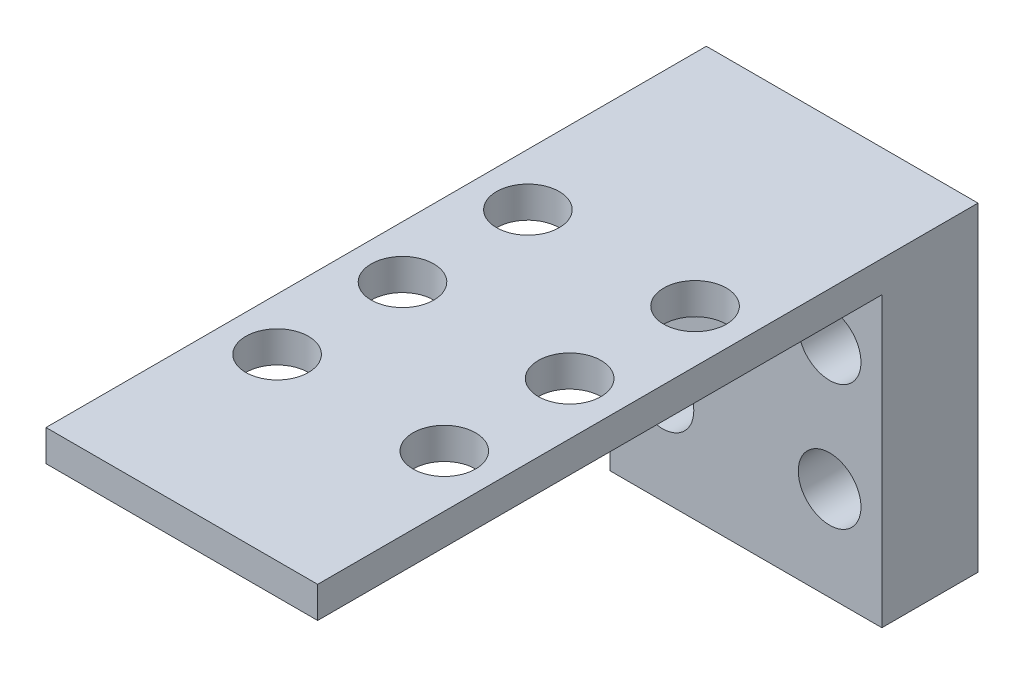
ISO-10303-21;
HEADER;
FILE_DESCRIPTION(('STEP AP214'),'2;1');
FILE_NAME('part.step','',(''),(''),'','','');
FILE_SCHEMA(('AUTOMOTIVE_DESIGN { 1 0 10303 214 1 1 1 1 }'));
ENDSEC;
DATA;
#1=APPLICATION_CONTEXT('core data for automotive mechanical design processes');
#2=APPLICATION_PROTOCOL_DEFINITION('international standard','automotive_design',2000,#1);
#3=PRODUCT_CONTEXT('',#1,'mechanical');
#4=PRODUCT('Part','Part','',(#3));
#5=PRODUCT_RELATED_PRODUCT_CATEGORY('part','',(#4));
#6=PRODUCT_DEFINITION_FORMATION('','',#4);
#7=PRODUCT_DEFINITION_CONTEXT('part definition',#1,'design');
#8=PRODUCT_DEFINITION('design','',#6,#7);
#9=PRODUCT_DEFINITION_SHAPE('','',#8);
#10=(LENGTH_UNIT() NAMED_UNIT(*) SI_UNIT(.MILLI.,.METRE.));
#11=(NAMED_UNIT(*) PLANE_ANGLE_UNIT() SI_UNIT($,.RADIAN.));
#12=(NAMED_UNIT(*) SI_UNIT($,.STERADIAN.) SOLID_ANGLE_UNIT());
#13=UNCERTAINTY_MEASURE_WITH_UNIT(LENGTH_MEASURE(1.E-05),#10,'distance_accuracy_value','');
#14=(GEOMETRIC_REPRESENTATION_CONTEXT(3) GLOBAL_UNCERTAINTY_ASSIGNED_CONTEXT((#13)) GLOBAL_UNIT_ASSIGNED_CONTEXT((#10,
#11,#12)) REPRESENTATION_CONTEXT('',''));
#15=CARTESIAN_POINT('',(0.,0.,0.));
#16=DIRECTION('',(0.,0.,1.));
#17=DIRECTION('',(1.,0.,0.));
#18=AXIS2_PLACEMENT_3D('',#15,#16,#17);
#19=CARTESIAN_POINT('',(-3.,43.5703212532729,17.04));
#20=DIRECTION('',(0.,-1.,0.));
#21=DIRECTION('',(0.,0.,-1.));
#22=AXIS2_PLACEMENT_3D('',#19,#20,#21);
#23=CYLINDRICAL_SURFACE('',#22,1.5);
#24=CARTESIAN_POINT('',(-3.,10.6036731257294,17.04));
#25=DIRECTION('',(0.,-1.,0.));
#26=DIRECTION('',(0.,0.,-1.));
#27=AXIS2_PLACEMENT_3D('',#24,#25,#26);
#28=CIRCLE('',#27,1.5);
#29=CARTESIAN_POINT('',(-3.,10.6036731257294,15.54));
#30=VERTEX_POINT('',#29);
#31=EDGE_CURVE('E12',#30,#30,#28,.T.);
#32=ORIENTED_EDGE('',*,*,#31,.F.);
#33=EDGE_LOOP('',(#32));
#34=FACE_BOUND('',#33,.T.);
#35=CARTESIAN_POINT('',(-3.,9.10367312572944,17.04));
#36=DIRECTION('',(0.,-1.,0.));
#37=DIRECTION('',(0.,0.,-1.));
#38=AXIS2_PLACEMENT_3D('',#35,#36,#37);
#39=CIRCLE('',#38,1.5);
#40=CARTESIAN_POINT('',(-3.,9.10367312572944,15.54));
#41=VERTEX_POINT('',#40);
#42=EDGE_CURVE('E171',#41,#41,#39,.T.);
#43=ORIENTED_EDGE('',*,*,#42,.T.);
#44=EDGE_LOOP('',(#43));
#45=FACE_BOUND('',#44,.T.);
#46=ADVANCED_FACE('F43',(#34,#45),#23,.F.);
#47=CARTESIAN_POINT('',(-3.,43.5703212532729,23.04));
#48=DIRECTION('',(0.,-1.,0.));
#49=DIRECTION('',(0.,0.,-1.));
#50=AXIS2_PLACEMENT_3D('',#47,#48,#49);
#51=CYLINDRICAL_SURFACE('',#50,1.5);
#52=CARTESIAN_POINT('',(-3.,10.6036731257294,23.04));
#53=DIRECTION('',(0.,-1.,0.));
#54=DIRECTION('',(0.,0.,-1.));
#55=AXIS2_PLACEMENT_3D('',#52,#53,#54);
#56=CIRCLE('',#55,1.5);
#57=CARTESIAN_POINT('',(-3.,10.6036731257294,21.54));
#58=VERTEX_POINT('',#57);
#59=EDGE_CURVE('E52',#58,#58,#56,.T.);
#60=ORIENTED_EDGE('',*,*,#59,.F.);
#61=EDGE_LOOP('',(#60));
#62=FACE_BOUND('',#61,.T.);
#63=CARTESIAN_POINT('',(-3.,9.10367312572944,23.04));
#64=DIRECTION('',(0.,-1.,0.));
#65=DIRECTION('',(0.,0.,-1.));
#66=AXIS2_PLACEMENT_3D('',#63,#64,#65);
#67=CIRCLE('',#66,1.5);
#68=CARTESIAN_POINT('',(-3.,9.10367312572944,21.54));
#69=VERTEX_POINT('',#68);
#70=EDGE_CURVE('E168',#69,#69,#67,.T.);
#71=ORIENTED_EDGE('',*,*,#70,.T.);
#72=EDGE_LOOP('',(#71));
#73=FACE_BOUND('',#72,.T.);
#74=ADVANCED_FACE('F265',(#62,#73),#51,.F.);
#75=CARTESIAN_POINT('',(5.,43.5703212532729,23.04));
#76=DIRECTION('',(0.,-1.,0.));
#77=DIRECTION('',(0.,0.,-1.));
#78=AXIS2_PLACEMENT_3D('',#75,#76,#77);
#79=CYLINDRICAL_SURFACE('',#78,1.5);
#80=CARTESIAN_POINT('',(5.,10.6036731257294,23.04));
#81=DIRECTION('',(0.,-1.,0.));
#82=DIRECTION('',(0.,0.,-1.));
#83=AXIS2_PLACEMENT_3D('',#80,#81,#82);
#84=CIRCLE('',#83,1.5);
#85=CARTESIAN_POINT('',(5.,10.6036731257294,21.54));
#86=VERTEX_POINT('',#85);
#87=EDGE_CURVE('E132',#86,#86,#84,.T.);
#88=ORIENTED_EDGE('',*,*,#87,.F.);
#89=EDGE_LOOP('',(#88));
#90=FACE_BOUND('',#89,.T.);
#91=CARTESIAN_POINT('',(5.,9.10367312572944,23.04));
#92=DIRECTION('',(0.,-1.,0.));
#93=DIRECTION('',(0.,0.,-1.));
#94=AXIS2_PLACEMENT_3D('',#91,#92,#93);
#95=CIRCLE('',#94,1.5);
#96=CARTESIAN_POINT('',(5.,9.10367312572944,21.54));
#97=VERTEX_POINT('',#96);
#98=EDGE_CURVE('E165',#97,#97,#95,.T.);
#99=ORIENTED_EDGE('',*,*,#98,.T.);
#100=EDGE_LOOP('',(#99));
#101=FACE_BOUND('',#100,.T.);
#102=ADVANCED_FACE('F271',(#90,#101),#79,.F.);
#103=CARTESIAN_POINT('',(5.,43.5703212532729,17.04));
#104=DIRECTION('',(0.,-1.,0.));
#105=DIRECTION('',(0.,0.,-1.));
#106=AXIS2_PLACEMENT_3D('',#103,#104,#105);
#107=CYLINDRICAL_SURFACE('',#106,1.5);
#108=CARTESIAN_POINT('',(5.,10.6036731257294,17.04));
#109=DIRECTION('',(0.,-1.,0.));
#110=DIRECTION('',(0.,0.,-1.));
#111=AXIS2_PLACEMENT_3D('',#108,#109,#110);
#112=CIRCLE('',#111,1.5);
#113=CARTESIAN_POINT('',(5.,10.6036731257294,15.54));
#114=VERTEX_POINT('',#113);
#115=EDGE_CURVE('E135',#114,#114,#112,.T.);
#116=ORIENTED_EDGE('',*,*,#115,.F.);
#117=EDGE_LOOP('',(#116));
#118=FACE_BOUND('',#117,.T.);
#119=CARTESIAN_POINT('',(5.,9.10367312572944,17.04));
#120=DIRECTION('',(0.,-1.,0.));
#121=DIRECTION('',(0.,0.,-1.));
#122=AXIS2_PLACEMENT_3D('',#119,#120,#121);
#123=CIRCLE('',#122,1.5);
#124=CARTESIAN_POINT('',(5.,9.10367312572944,15.54));
#125=VERTEX_POINT('',#124);
#126=EDGE_CURVE('E158',#125,#125,#123,.T.);
#127=ORIENTED_EDGE('',*,*,#126,.T.);
#128=EDGE_LOOP('',(#127));
#129=FACE_BOUND('',#128,.T.);
#130=ADVANCED_FACE('F317',(#118,#129),#107,.F.);
#131=CARTESIAN_POINT('',(-3.,43.5703212532729,11.04));
#132=DIRECTION('',(0.,-1.,0.));
#133=DIRECTION('',(0.,0.,-1.));
#134=AXIS2_PLACEMENT_3D('',#131,#132,#133);
#135=CYLINDRICAL_SURFACE('',#134,1.5);
#136=CARTESIAN_POINT('',(-3.,10.6036731257294,11.04));
#137=DIRECTION('',(0.,-1.,0.));
#138=DIRECTION('',(0.,0.,-1.));
#139=AXIS2_PLACEMENT_3D('',#136,#137,#138);
#140=CIRCLE('',#139,1.5);
#141=CARTESIAN_POINT('',(-3.,10.6036731257294,9.54));
#142=VERTEX_POINT('',#141);
#143=EDGE_CURVE('E137',#142,#142,#140,.T.);
#144=ORIENTED_EDGE('',*,*,#143,.F.);
#145=EDGE_LOOP('',(#144));
#146=FACE_BOUND('',#145,.T.);
#147=CARTESIAN_POINT('',(-3.,9.10367312572944,11.04));
#148=DIRECTION('',(0.,-1.,0.));
#149=DIRECTION('',(0.,0.,-1.));
#150=AXIS2_PLACEMENT_3D('',#147,#148,#149);
#151=CIRCLE('',#150,1.5);
#152=CARTESIAN_POINT('',(-3.,9.10367312572944,9.54));
#153=VERTEX_POINT('',#152);
#154=EDGE_CURVE('E155',#153,#153,#151,.T.);
#155=ORIENTED_EDGE('',*,*,#154,.T.);
#156=EDGE_LOOP('',(#155));
#157=FACE_BOUND('',#156,.T.);
#158=ADVANCED_FACE('F149',(#146,#157),#135,.F.);
#159=CARTESIAN_POINT('',(5.,43.5703212532729,11.04));
#160=DIRECTION('',(0.,-1.,0.));
#161=DIRECTION('',(0.,0.,-1.));
#162=AXIS2_PLACEMENT_3D('',#159,#160,#161);
#163=CYLINDRICAL_SURFACE('',#162,1.5);
#164=CARTESIAN_POINT('',(5.,10.6036731257294,11.04));
#165=DIRECTION('',(0.,-1.,0.));
#166=DIRECTION('',(0.,0.,-1.));
#167=AXIS2_PLACEMENT_3D('',#164,#165,#166);
#168=CIRCLE('',#167,1.5);
#169=CARTESIAN_POINT('',(5.,10.6036731257294,9.53999999999999));
#170=VERTEX_POINT('',#169);
#171=EDGE_CURVE('E47',#170,#170,#168,.T.);
#172=ORIENTED_EDGE('',*,*,#171,.F.);
#173=EDGE_LOOP('',(#172));
#174=FACE_BOUND('',#173,.T.);
#175=CARTESIAN_POINT('',(5.,9.10367312572944,11.04));
#176=DIRECTION('',(0.,-1.,0.));
#177=DIRECTION('',(0.,0.,-1.));
#178=AXIS2_PLACEMENT_3D('',#175,#176,#177);
#179=CIRCLE('',#178,1.5);
#180=CARTESIAN_POINT('',(5.,9.10367312572944,9.53999999999999));
#181=VERTEX_POINT('',#180);
#182=EDGE_CURVE('E153',#181,#181,#179,.T.);
#183=ORIENTED_EDGE('',*,*,#182,.T.);
#184=EDGE_LOOP('',(#183));
#185=FACE_BOUND('',#184,.T.);
#186=ADVANCED_FACE('F146',(#174,#185),#163,.F.);
#187=CARTESIAN_POINT('',(7.5,43.5703212532729,31.6));
#188=DIRECTION('',(0.,0.,-1.));
#189=DIRECTION('',(-1.,0.,0.));
#190=AXIS2_PLACEMENT_3D('',#187,#188,#189);
#191=PLANE('',#190);
#192=DIRECTION('',(-1.,0.,0.));
#193=VECTOR('',#192,1.);
#194=CARTESIAN_POINT('',(7.5,9.10367312572944,31.6));
#195=LINE('',#194,#193);
#196=CARTESIAN_POINT('',(7.5,9.10367312572944,31.6));
#197=VERTEX_POINT('',#196);
#198=CARTESIAN_POINT('',(-5.5,9.10367312572944,31.6));
#199=VERTEX_POINT('',#198);
#200=EDGE_CURVE('E97',#197,#199,#195,.T.);
#201=ORIENTED_EDGE('',*,*,#200,.F.);
#202=DIRECTION('',(0.,-1.,0.));
#203=VECTOR('',#202,1.);
#204=CARTESIAN_POINT('',(7.5,43.5703212532729,31.6));
#205=LINE('',#204,#203);
#206=CARTESIAN_POINT('',(7.5,10.6036731257294,31.6));
#207=VERTEX_POINT('',#206);
#208=EDGE_CURVE('E120',#207,#197,#205,.T.);
#209=ORIENTED_EDGE('',*,*,#208,.F.);
#210=DIRECTION('',(-1.,0.,0.));
#211=VECTOR('',#210,1.);
#212=CARTESIAN_POINT('',(7.5,10.6036731257294,31.6));
#213=LINE('',#212,#211);
#214=CARTESIAN_POINT('',(-5.5,10.6036731257294,31.6));
#215=VERTEX_POINT('',#214);
#216=EDGE_CURVE('E65',#207,#215,#213,.T.);
#217=ORIENTED_EDGE('',*,*,#216,.T.);
#218=DIRECTION('',(0.,-1.,0.));
#219=VECTOR('',#218,1.);
#220=CARTESIAN_POINT('',(-5.5,43.5703212532729,31.6));
#221=LINE('',#220,#219);
#222=EDGE_CURVE('E110',#215,#199,#221,.T.);
#223=ORIENTED_EDGE('',*,*,#222,.T.);
#224=EDGE_LOOP('',(#201,#209,#217,#223));
#225=FACE_BOUND('',#224,.T.);
#226=ADVANCED_FACE('F116',(#225),#191,.F.);
#227=CARTESIAN_POINT('',(-5.5,10.6036731257294,4.6));
#228=DIRECTION('',(0.,-1.,0.));
#229=DIRECTION('',(0.,0.,-1.));
#230=AXIS2_PLACEMENT_3D('',#227,#228,#229);
#231=PLANE('',#230);
#232=ORIENTED_EDGE('',*,*,#171,.T.);
#233=EDGE_LOOP('',(#232));
#234=FACE_BOUND('',#233,.T.);
#235=ORIENTED_EDGE('',*,*,#143,.T.);
#236=EDGE_LOOP('',(#235));
#237=FACE_BOUND('',#236,.T.);
#238=ORIENTED_EDGE('',*,*,#115,.T.);
#239=EDGE_LOOP('',(#238));
#240=FACE_BOUND('',#239,.T.);
#241=ORIENTED_EDGE('',*,*,#87,.T.);
#242=EDGE_LOOP('',(#241));
#243=FACE_BOUND('',#242,.T.);
#244=ORIENTED_EDGE('',*,*,#59,.T.);
#245=EDGE_LOOP('',(#244));
#246=FACE_BOUND('',#245,.T.);
#247=ORIENTED_EDGE('',*,*,#31,.T.);
#248=EDGE_LOOP('',(#247));
#249=FACE_BOUND('',#248,.T.);
#250=ORIENTED_EDGE('',*,*,#216,.F.);
#251=DIRECTION('',(0.,0.,1.));
#252=VECTOR('',#251,1.);
#253=CARTESIAN_POINT('',(7.5,10.6036731257294,4.6));
#254=LINE('',#253,#252);
#255=CARTESIAN_POINT('',(7.5,10.6036731257294,0.));
#256=VERTEX_POINT('',#255);
#257=EDGE_CURVE('E117',#256,#207,#254,.T.);
#258=ORIENTED_EDGE('',*,*,#257,.F.);
#259=DIRECTION('',(-1.,0.,0.));
#260=VECTOR('',#259,1.);
#261=CARTESIAN_POINT('',(-5.5,10.6036731257294,0.));
#262=LINE('',#261,#260);
#263=CARTESIAN_POINT('',(-5.5,10.6036731257294,0.));
#264=VERTEX_POINT('',#263);
#265=EDGE_CURVE('E128',#256,#264,#262,.T.);
#266=ORIENTED_EDGE('',*,*,#265,.T.);
#267=DIRECTION('',(0.,0.,-1.));
#268=VECTOR('',#267,1.);
#269=CARTESIAN_POINT('',(-5.5,10.6036731257294,31.6));
#270=LINE('',#269,#268);
#271=EDGE_CURVE('E60',#215,#264,#270,.T.);
#272=ORIENTED_EDGE('',*,*,#271,.F.);
#273=EDGE_LOOP('',(#250,#258,#266,#272));
#274=FACE_BOUND('',#273,.T.);
#275=ADVANCED_FACE('F144',(#234,#237,#240,#243,#246,#249,#274),#231,.F.);
#276=CARTESIAN_POINT('',(-5.5,7.60367312572944,4.6));
#277=DIRECTION('',(1.,0.,0.));
#278=DIRECTION('',(0.,1.,0.));
#279=AXIS2_PLACEMENT_3D('',#276,#277,#278);
#280=PLANE('',#279);
#281=DIRECTION('',(0.,1.,0.));
#282=VECTOR('',#281,1.);
#283=CARTESIAN_POINT('',(-5.5,7.60367312572944,4.6));
#284=LINE('',#283,#282);
#285=CARTESIAN_POINT('',(-5.5,-4.69632687427055,4.6));
#286=VERTEX_POINT('',#285);
#287=CARTESIAN_POINT('',(-5.5,9.10367312572944,4.6));
#288=VERTEX_POINT('',#287);
#289=EDGE_CURVE('E112',#286,#288,#284,.T.);
#290=ORIENTED_EDGE('',*,*,#289,.T.);
#291=DIRECTION('',(0.,0.,-1.));
#292=VECTOR('',#291,1.);
#293=CARTESIAN_POINT('',(-5.5,9.10367312572944,31.6));
#294=LINE('',#293,#292);
#295=EDGE_CURVE('E101',#199,#288,#294,.T.);
#296=ORIENTED_EDGE('',*,*,#295,.F.);
#297=ORIENTED_EDGE('',*,*,#222,.F.);
#298=ORIENTED_EDGE('',*,*,#271,.T.);
#299=DIRECTION('',(0.,-1.,0.));
#300=VECTOR('',#299,1.);
#301=CARTESIAN_POINT('',(-5.5,7.60367312572945,0.));
#302=LINE('',#301,#300);
#303=CARTESIAN_POINT('',(-5.5,-4.69632687427055,0.));
#304=VERTEX_POINT('',#303);
#305=EDGE_CURVE('E125',#264,#304,#302,.T.);
#306=ORIENTED_EDGE('',*,*,#305,.T.);
#307=DIRECTION('',(0.,0.,-1.));
#308=VECTOR('',#307,1.);
#309=CARTESIAN_POINT('',(-5.5,-4.69632687427055,4.6));
#310=LINE('',#309,#308);
#311=EDGE_CURVE('E175',#286,#304,#310,.T.);
#312=ORIENTED_EDGE('',*,*,#311,.F.);
#313=EDGE_LOOP('',(#290,#296,#297,#298,#306,#312));
#314=FACE_BOUND('',#313,.T.);
#315=ADVANCED_FACE('F109',(#314),#280,.F.);
#316=CARTESIAN_POINT('',(7.5,7.60367312572944,4.6));
#317=DIRECTION('',(-1.,0.,0.));
#318=DIRECTION('',(0.,-1.,0.));
#319=AXIS2_PLACEMENT_3D('',#316,#317,#318);
#320=PLANE('',#319);
#321=DIRECTION('',(0.,0.,1.));
#322=VECTOR('',#321,1.);
#323=CARTESIAN_POINT('',(7.5,9.10367312572944,4.6));
#324=LINE('',#323,#322);
#325=CARTESIAN_POINT('',(7.5,9.10367312572944,4.6));
#326=VERTEX_POINT('',#325);
#327=EDGE_CURVE('E103',#326,#197,#324,.T.);
#328=ORIENTED_EDGE('',*,*,#327,.F.);
#329=DIRECTION('',(0.,-1.,0.));
#330=VECTOR('',#329,1.);
#331=CARTESIAN_POINT('',(7.5,-4.69632687427055,4.6));
#332=LINE('',#331,#330);
#333=CARTESIAN_POINT('',(7.5,-4.69632687427055,4.6));
#334=VERTEX_POINT('',#333);
#335=EDGE_CURVE('E174',#326,#334,#332,.T.);
#336=ORIENTED_EDGE('',*,*,#335,.T.);
#337=DIRECTION('',(0.,0.,-1.));
#338=VECTOR('',#337,1.);
#339=CARTESIAN_POINT('',(7.5,-4.69632687427055,4.6));
#340=LINE('',#339,#338);
#341=CARTESIAN_POINT('',(7.5,-4.69632687427055,0.));
#342=VERTEX_POINT('',#341);
#343=EDGE_CURVE('E180',#334,#342,#340,.T.);
#344=ORIENTED_EDGE('',*,*,#343,.T.);
#345=DIRECTION('',(0.,1.,0.));
#346=VECTOR('',#345,1.);
#347=CARTESIAN_POINT('',(7.5,10.6036731257294,0.));
#348=LINE('',#347,#346);
#349=EDGE_CURVE('E213',#342,#256,#348,.T.);
#350=ORIENTED_EDGE('',*,*,#349,.T.);
#351=ORIENTED_EDGE('',*,*,#257,.T.);
#352=ORIENTED_EDGE('',*,*,#208,.T.);
#353=EDGE_LOOP('',(#328,#336,#344,#350,#351,#352));
#354=FACE_BOUND('',#353,.T.);
#355=ADVANCED_FACE('F45',(#354),#320,.F.);
#356=CARTESIAN_POINT('',(0.,0.,0.));
#357=DIRECTION('',(0.,0.,1.));
#358=DIRECTION('',(1.,0.,0.));
#359=AXIS2_PLACEMENT_3D('',#356,#357,#358);
#360=PLANE('',#359);
#361=ORIENTED_EDGE('',*,*,#349,.F.);
#362=DIRECTION('',(1.,0.,0.));
#363=VECTOR('',#362,1.);
#364=CARTESIAN_POINT('',(-5.5,-4.69632687427055,0.));
#365=LINE('',#364,#363);
#366=EDGE_CURVE('E179',#304,#342,#365,.T.);
#367=ORIENTED_EDGE('',*,*,#366,.F.);
#368=ORIENTED_EDGE('',*,*,#305,.F.);
#369=ORIENTED_EDGE('',*,*,#265,.F.);
#370=EDGE_LOOP('',(#361,#367,#368,#369));
#371=FACE_BOUND('',#370,.T.);
#372=CARTESIAN_POINT('',(-3.,5.80367312572944,0.));
#373=DIRECTION('',(0.,0.,1.));
#374=DIRECTION('',(1.,0.,0.));
#375=AXIS2_PLACEMENT_3D('',#372,#373,#374);
#376=CIRCLE('',#375,1.5);
#377=CARTESIAN_POINT('',(-1.50000000000001,5.80367312572944,0.));
#378=VERTEX_POINT('',#377);
#379=EDGE_CURVE('E189',#378,#378,#376,.T.);
#380=ORIENTED_EDGE('',*,*,#379,.T.);
#381=EDGE_LOOP('',(#380));
#382=FACE_BOUND('',#381,.T.);
#383=CARTESIAN_POINT('',(5.,-0.196326874270553,0.));
#384=DIRECTION('',(0.,0.,1.));
#385=DIRECTION('',(-1.,0.,0.));
#386=AXIS2_PLACEMENT_3D('',#383,#384,#385);
#387=CIRCLE('',#386,1.5);
#388=CARTESIAN_POINT('',(3.5,-0.196326874270553,0.));
#389=VERTEX_POINT('',#388);
#390=EDGE_CURVE('E192',#389,#389,#387,.T.);
#391=ORIENTED_EDGE('',*,*,#390,.T.);
#392=EDGE_LOOP('',(#391));
#393=FACE_BOUND('',#392,.T.);
#394=CARTESIAN_POINT('',(-3.,-0.196326874270555,0.));
#395=DIRECTION('',(0.,0.,1.));
#396=DIRECTION('',(1.,0.,0.));
#397=AXIS2_PLACEMENT_3D('',#394,#395,#396);
#398=CIRCLE('',#397,1.5);
#399=CARTESIAN_POINT('',(-1.5,-0.196326874270555,0.));
#400=VERTEX_POINT('',#399);
#401=EDGE_CURVE('E198',#400,#400,#398,.T.);
#402=ORIENTED_EDGE('',*,*,#401,.T.);
#403=EDGE_LOOP('',(#402));
#404=FACE_BOUND('',#403,.T.);
#405=CARTESIAN_POINT('',(5.,5.80367312572945,0.));
#406=DIRECTION('',(0.,0.,1.));
#407=DIRECTION('',(-1.,0.,0.));
#408=AXIS2_PLACEMENT_3D('',#405,#406,#407);
#409=CIRCLE('',#408,1.5);
#410=CARTESIAN_POINT('',(3.5,5.80367312572945,0.));
#411=VERTEX_POINT('',#410);
#412=EDGE_CURVE('E185',#411,#411,#409,.T.);
#413=ORIENTED_EDGE('',*,*,#412,.T.);
#414=EDGE_LOOP('',(#413));
#415=FACE_BOUND('',#414,.T.);
#416=ADVANCED_FACE('F218',(#371,#382,#393,#404,#415),#360,.F.);
#417=CARTESIAN_POINT('',(0.,0.,4.6));
#418=DIRECTION('',(0.,0.,1.));
#419=DIRECTION('',(1.,0.,0.));
#420=AXIS2_PLACEMENT_3D('',#417,#418,#419);
#421=PLANE('',#420);
#422=CARTESIAN_POINT('',(5.,-0.196326874270553,4.6));
#423=DIRECTION('',(0.,0.,1.));
#424=DIRECTION('',(-1.,0.,0.));
#425=AXIS2_PLACEMENT_3D('',#422,#423,#424);
#426=CIRCLE('',#425,1.5);
#427=CARTESIAN_POINT('',(3.5,-0.196326874270553,4.6));
#428=VERTEX_POINT('',#427);
#429=EDGE_CURVE('E195',#428,#428,#426,.T.);
#430=ORIENTED_EDGE('',*,*,#429,.F.);
#431=EDGE_LOOP('',(#430));
#432=FACE_BOUND('',#431,.T.);
#433=CARTESIAN_POINT('',(-3.,-0.196326874270555,4.6));
#434=DIRECTION('',(0.,0.,1.));
#435=DIRECTION('',(1.,0.,0.));
#436=AXIS2_PLACEMENT_3D('',#433,#434,#435);
#437=CIRCLE('',#436,1.5);
#438=CARTESIAN_POINT('',(-1.5,-0.196326874270555,4.6));
#439=VERTEX_POINT('',#438);
#440=EDGE_CURVE('E201',#439,#439,#437,.T.);
#441=ORIENTED_EDGE('',*,*,#440,.F.);
#442=EDGE_LOOP('',(#441));
#443=FACE_BOUND('',#442,.T.);
#444=DIRECTION('',(1.,0.,0.));
#445=VECTOR('',#444,1.);
#446=CARTESIAN_POINT('',(-5.5,-4.69632687427055,4.6));
#447=LINE('',#446,#445);
#448=EDGE_CURVE('E186',#286,#334,#447,.T.);
#449=ORIENTED_EDGE('',*,*,#448,.T.);
#450=ORIENTED_EDGE('',*,*,#335,.F.);
#451=DIRECTION('',(1.,0.,0.));
#452=VECTOR('',#451,1.);
#453=CARTESIAN_POINT('',(-5.5,9.10367312572944,4.6));
#454=LINE('',#453,#452);
#455=EDGE_CURVE('E114',#288,#326,#454,.T.);
#456=ORIENTED_EDGE('',*,*,#455,.F.);
#457=ORIENTED_EDGE('',*,*,#289,.F.);
#458=EDGE_LOOP('',(#449,#450,#456,#457));
#459=FACE_BOUND('',#458,.T.);
#460=CARTESIAN_POINT('',(5.,5.80367312572945,4.6));
#461=DIRECTION('',(0.,0.,1.));
#462=DIRECTION('',(-1.,0.,0.));
#463=AXIS2_PLACEMENT_3D('',#460,#461,#462);
#464=CIRCLE('',#463,1.5);
#465=CARTESIAN_POINT('',(3.5,5.80367312572945,4.6));
#466=VERTEX_POINT('',#465);
#467=EDGE_CURVE('E206',#466,#466,#464,.T.);
#468=ORIENTED_EDGE('',*,*,#467,.F.);
#469=EDGE_LOOP('',(#468));
#470=FACE_BOUND('',#469,.T.);
#471=CARTESIAN_POINT('',(-3.,5.80367312572944,4.6));
#472=DIRECTION('',(0.,0.,1.));
#473=DIRECTION('',(1.,0.,0.));
#474=AXIS2_PLACEMENT_3D('',#471,#472,#473);
#475=CIRCLE('',#474,1.5);
#476=CARTESIAN_POINT('',(-1.50000000000001,5.80367312572944,4.6));
#477=VERTEX_POINT('',#476);
#478=EDGE_CURVE('E178',#477,#477,#475,.T.);
#479=ORIENTED_EDGE('',*,*,#478,.F.);
#480=EDGE_LOOP('',(#479));
#481=FACE_BOUND('',#480,.T.);
#482=ADVANCED_FACE('F227',(#432,#443,#459,#470,#481),#421,.T.);
#483=CARTESIAN_POINT('',(-5.5,-4.69632687427055,4.6));
#484=DIRECTION('',(0.,1.,0.));
#485=DIRECTION('',(0.,0.,1.));
#486=AXIS2_PLACEMENT_3D('',#483,#484,#485);
#487=PLANE('',#486);
#488=ORIENTED_EDGE('',*,*,#366,.T.);
#489=ORIENTED_EDGE('',*,*,#343,.F.);
#490=ORIENTED_EDGE('',*,*,#448,.F.);
#491=ORIENTED_EDGE('',*,*,#311,.T.);
#492=EDGE_LOOP('',(#488,#489,#490,#491));
#493=FACE_BOUND('',#492,.T.);
#494=ADVANCED_FACE('F225',(#493),#487,.F.);
#495=CARTESIAN_POINT('',(-3.,5.80367312572944,4.6));
#496=DIRECTION('',(0.,0.,-1.));
#497=DIRECTION('',(-1.,0.,0.));
#498=AXIS2_PLACEMENT_3D('',#495,#496,#497);
#499=CYLINDRICAL_SURFACE('',#498,1.5);
#500=ORIENTED_EDGE('',*,*,#478,.T.);
#501=EDGE_LOOP('',(#500));
#502=FACE_BOUND('',#501,.T.);
#503=ORIENTED_EDGE('',*,*,#379,.F.);
#504=EDGE_LOOP('',(#503));
#505=FACE_BOUND('',#504,.T.);
#506=ADVANCED_FACE('F236',(#502,#505),#499,.F.);
#507=CARTESIAN_POINT('',(5.,-0.196326874270553,4.6));
#508=DIRECTION('',(0.,0.,-1.));
#509=DIRECTION('',(-1.,0.,0.));
#510=AXIS2_PLACEMENT_3D('',#507,#508,#509);
#511=CYLINDRICAL_SURFACE('',#510,1.5);
#512=ORIENTED_EDGE('',*,*,#429,.T.);
#513=EDGE_LOOP('',(#512));
#514=FACE_BOUND('',#513,.T.);
#515=ORIENTED_EDGE('',*,*,#390,.F.);
#516=EDGE_LOOP('',(#515));
#517=FACE_BOUND('',#516,.T.);
#518=ADVANCED_FACE('F239',(#514,#517),#511,.F.);
#519=CARTESIAN_POINT('',(-3.,-0.196326874270555,4.6));
#520=DIRECTION('',(0.,0.,-1.));
#521=DIRECTION('',(-1.,0.,0.));
#522=AXIS2_PLACEMENT_3D('',#519,#520,#521);
#523=CYLINDRICAL_SURFACE('',#522,1.5);
#524=ORIENTED_EDGE('',*,*,#440,.T.);
#525=EDGE_LOOP('',(#524));
#526=FACE_BOUND('',#525,.T.);
#527=ORIENTED_EDGE('',*,*,#401,.F.);
#528=EDGE_LOOP('',(#527));
#529=FACE_BOUND('',#528,.T.);
#530=ADVANCED_FACE('F253',(#526,#529),#523,.F.);
#531=CARTESIAN_POINT('',(5.,5.80367312572945,4.6));
#532=DIRECTION('',(0.,0.,-1.));
#533=DIRECTION('',(-1.,0.,0.));
#534=AXIS2_PLACEMENT_3D('',#531,#532,#533);
#535=CYLINDRICAL_SURFACE('',#534,1.5);
#536=ORIENTED_EDGE('',*,*,#467,.T.);
#537=EDGE_LOOP('',(#536));
#538=FACE_BOUND('',#537,.T.);
#539=ORIENTED_EDGE('',*,*,#412,.F.);
#540=EDGE_LOOP('',(#539));
#541=FACE_BOUND('',#540,.T.);
#542=ADVANCED_FACE('F251',(#538,#541),#535,.F.);
#543=CARTESIAN_POINT('',(0.,9.10367312572944,0.));
#544=DIRECTION('',(0.,-1.,0.));
#545=DIRECTION('',(0.,0.,-1.));
#546=AXIS2_PLACEMENT_3D('',#543,#544,#545);
#547=PLANE('',#546);
#548=ORIENTED_EDGE('',*,*,#42,.F.);
#549=EDGE_LOOP('',(#548));
#550=FACE_BOUND('',#549,.T.);
#551=ORIENTED_EDGE('',*,*,#70,.F.);
#552=EDGE_LOOP('',(#551));
#553=FACE_BOUND('',#552,.T.);
#554=ORIENTED_EDGE('',*,*,#98,.F.);
#555=EDGE_LOOP('',(#554));
#556=FACE_BOUND('',#555,.T.);
#557=ORIENTED_EDGE('',*,*,#126,.F.);
#558=EDGE_LOOP('',(#557));
#559=FACE_BOUND('',#558,.T.);
#560=ORIENTED_EDGE('',*,*,#154,.F.);
#561=EDGE_LOOP('',(#560));
#562=FACE_BOUND('',#561,.T.);
#563=ORIENTED_EDGE('',*,*,#182,.F.);
#564=EDGE_LOOP('',(#563));
#565=FACE_BOUND('',#564,.T.);
#566=ORIENTED_EDGE('',*,*,#200,.T.);
#567=ORIENTED_EDGE('',*,*,#295,.T.);
#568=ORIENTED_EDGE('',*,*,#455,.T.);
#569=ORIENTED_EDGE('',*,*,#327,.T.);
#570=EDGE_LOOP('',(#566,#567,#568,#569));
#571=FACE_BOUND('',#570,.T.);
#572=ADVANCED_FACE('F99',(#550,#553,#556,#559,#562,#565,#571),#547,.T.);
#573=CLOSED_SHELL('',(#46,#74,#102,#130,#158,#186,#226,#275,#315,#355,#416,#482,#494,#506,#518,
#530,#542,#572));
#574=MANIFOLD_SOLID_BREP('B2',#573);
#575=ADVANCED_BREP_SHAPE_REPRESENTATION('',(#18,#574),#14);
#576=SHAPE_DEFINITION_REPRESENTATION(#9,#575);
ENDSEC;
END-ISO-10303-21;
